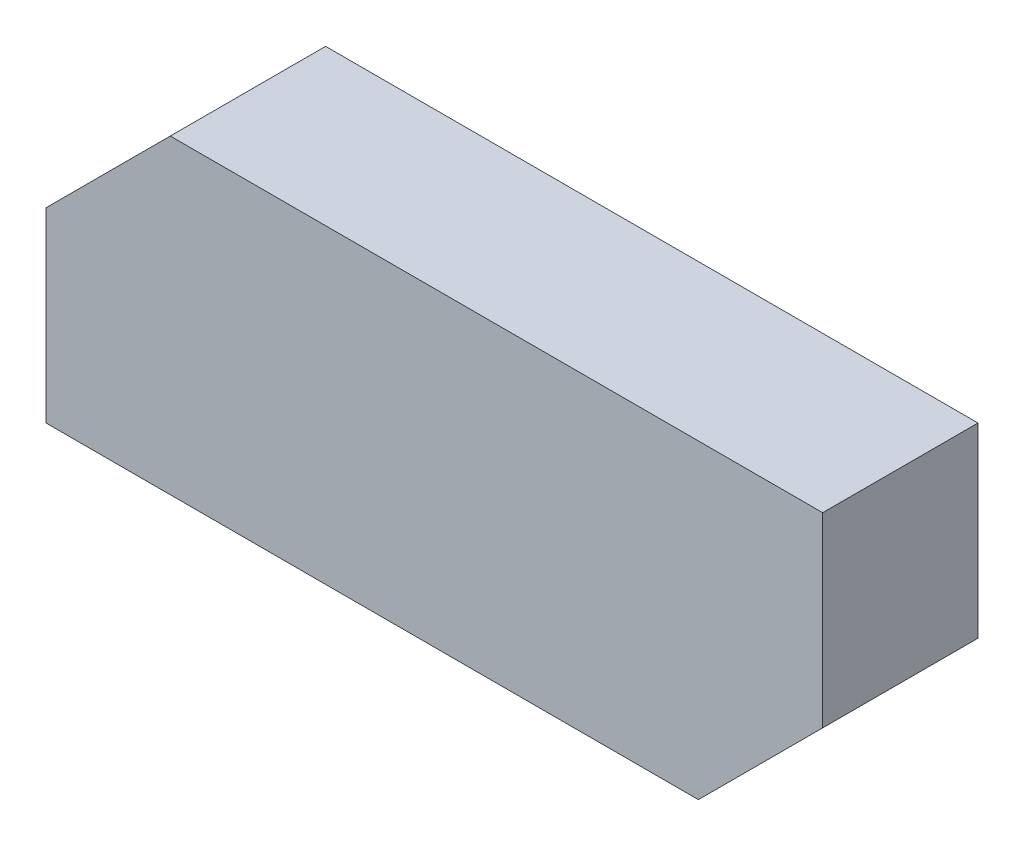
ISO-10303-21;
HEADER;
FILE_DESCRIPTION(('STEP AP214'),'2;1');
FILE_NAME('part.step','',(''),(''),'','','');
FILE_SCHEMA(('AUTOMOTIVE_DESIGN { 1 0 10303 214 1 1 1 1 }'));
ENDSEC;
DATA;
#1=APPLICATION_CONTEXT('core data for automotive mechanical design processes');
#2=APPLICATION_PROTOCOL_DEFINITION('international standard','automotive_design',2000,#1);
#3=PRODUCT_CONTEXT('',#1,'mechanical');
#4=PRODUCT('Part','Part','',(#3));
#5=PRODUCT_RELATED_PRODUCT_CATEGORY('part','',(#4));
#6=PRODUCT_DEFINITION_FORMATION('','',#4);
#7=PRODUCT_DEFINITION_CONTEXT('part definition',#1,'design');
#8=PRODUCT_DEFINITION('design','',#6,#7);
#9=PRODUCT_DEFINITION_SHAPE('','',#8);
#10=(LENGTH_UNIT() NAMED_UNIT(*) SI_UNIT(.MILLI.,.METRE.));
#11=(NAMED_UNIT(*) PLANE_ANGLE_UNIT() SI_UNIT($,.RADIAN.));
#12=(NAMED_UNIT(*) SI_UNIT($,.STERADIAN.) SOLID_ANGLE_UNIT());
#13=UNCERTAINTY_MEASURE_WITH_UNIT(LENGTH_MEASURE(1.E-05),#10,'distance_accuracy_value','');
#14=(GEOMETRIC_REPRESENTATION_CONTEXT(3) GLOBAL_UNCERTAINTY_ASSIGNED_CONTEXT((#13)) GLOBAL_UNIT_ASSIGNED_CONTEXT((#10,
#11,#12)) REPRESENTATION_CONTEXT('',''));
#15=CARTESIAN_POINT('',(0.,0.,0.));
#16=DIRECTION('',(0.,0.,1.));
#17=DIRECTION('',(1.,0.,0.));
#18=AXIS2_PLACEMENT_3D('',#15,#16,#17);
#19=CARTESIAN_POINT('',(25.,10.,10.));
#20=DIRECTION('',(-1.,0.,0.));
#21=DIRECTION('',(0.,-1.,0.));
#22=AXIS2_PLACEMENT_3D('',#19,#20,#21);
#23=PLANE('',#22);
#24=DIRECTION('',(0.,1.,0.));
#25=VECTOR('',#24,1.);
#26=CARTESIAN_POINT('',(25.,10.,10.));
#27=LINE('',#26,#25);
#28=CARTESIAN_POINT('',(25.,-2.00000000000001,10.));
#29=VERTEX_POINT('',#28);
#30=CARTESIAN_POINT('',(25.,10.,10.));
#31=VERTEX_POINT('',#30);
#32=EDGE_CURVE('E85',#29,#31,#27,.T.);
#33=ORIENTED_EDGE('',*,*,#32,.F.);
#34=DIRECTION('',(0.,0.,-1.));
#35=VECTOR('',#34,1.);
#36=CARTESIAN_POINT('',(25.,-2.00000000000001,10.));
#37=LINE('',#36,#35);
#38=CARTESIAN_POINT('',(25.,-2.00000000000001,0.));
#39=VERTEX_POINT('',#38);
#40=EDGE_CURVE('E105',#29,#39,#37,.T.);
#41=ORIENTED_EDGE('',*,*,#40,.T.);
#42=DIRECTION('',(0.,1.,0.));
#43=VECTOR('',#42,1.);
#44=CARTESIAN_POINT('',(25.,10.,0.));
#45=LINE('',#44,#43);
#46=CARTESIAN_POINT('',(25.,10.,0.));
#47=VERTEX_POINT('',#46);
#48=EDGE_CURVE('E103',#39,#47,#45,.T.);
#49=ORIENTED_EDGE('',*,*,#48,.T.);
#50=DIRECTION('',(0.,0.,-1.));
#51=VECTOR('',#50,1.);
#52=CARTESIAN_POINT('',(25.,10.,10.));
#53=LINE('',#52,#51);
#54=EDGE_CURVE('E99',#31,#47,#53,.T.);
#55=ORIENTED_EDGE('',*,*,#54,.F.);
#56=EDGE_LOOP('',(#33,#41,#49,#55));
#57=FACE_BOUND('',#56,.T.);
#58=ADVANCED_FACE('F34',(#57),#23,.F.);
#59=CARTESIAN_POINT('',(-25.,10.,10.));
#60=DIRECTION('',(0.,-1.,0.));
#61=DIRECTION('',(0.,0.,-1.));
#62=AXIS2_PLACEMENT_3D('',#59,#60,#61);
#63=PLANE('',#62);
#64=DIRECTION('',(-1.,0.,0.));
#65=VECTOR('',#64,1.);
#66=CARTESIAN_POINT('',(-25.,10.,0.));
#67=LINE('',#66,#65);
#68=CARTESIAN_POINT('',(-17.,10.,0.));
#69=VERTEX_POINT('',#68);
#70=EDGE_CURVE('E133',#47,#69,#67,.T.);
#71=ORIENTED_EDGE('',*,*,#70,.T.);
#72=DIRECTION('',(0.,0.,1.));
#73=VECTOR('',#72,1.);
#74=CARTESIAN_POINT('',(-17.,10.,10.));
#75=LINE('',#74,#73);
#76=CARTESIAN_POINT('',(-17.,10.,10.));
#77=VERTEX_POINT('',#76);
#78=EDGE_CURVE('E11',#69,#77,#75,.T.);
#79=ORIENTED_EDGE('',*,*,#78,.T.);
#80=DIRECTION('',(-1.,0.,0.));
#81=VECTOR('',#80,1.);
#82=CARTESIAN_POINT('',(-25.,10.,10.));
#83=LINE('',#82,#81);
#84=EDGE_CURVE('E88',#31,#77,#83,.T.);
#85=ORIENTED_EDGE('',*,*,#84,.F.);
#86=ORIENTED_EDGE('',*,*,#54,.T.);
#87=EDGE_LOOP('',(#71,#79,#85,#86));
#88=FACE_BOUND('',#87,.T.);
#89=ADVANCED_FACE('F98',(#88),#63,.F.);
#90=CARTESIAN_POINT('',(-25.,10.,10.));
#91=DIRECTION('',(1.,0.,0.));
#92=DIRECTION('',(0.,1.,0.));
#93=AXIS2_PLACEMENT_3D('',#90,#91,#92);
#94=PLANE('',#93);
#95=DIRECTION('',(0.,-1.,0.));
#96=VECTOR('',#95,1.);
#97=CARTESIAN_POINT('',(-25.,10.,10.));
#98=LINE('',#97,#96);
#99=CARTESIAN_POINT('',(-25.,2.00000000000001,10.));
#100=VERTEX_POINT('',#99);
#101=CARTESIAN_POINT('',(-25.,-10.,10.));
#102=VERTEX_POINT('',#101);
#103=EDGE_CURVE('E100',#100,#102,#98,.T.);
#104=ORIENTED_EDGE('',*,*,#103,.F.);
#105=DIRECTION('',(0.,0.,-1.));
#106=VECTOR('',#105,1.);
#107=CARTESIAN_POINT('',(-25.,2.00000000000001,10.));
#108=LINE('',#107,#106);
#109=CARTESIAN_POINT('',(-25.,2.00000000000001,0.));
#110=VERTEX_POINT('',#109);
#111=EDGE_CURVE('E42',#100,#110,#108,.T.);
#112=ORIENTED_EDGE('',*,*,#111,.T.);
#113=DIRECTION('',(0.,-1.,0.));
#114=VECTOR('',#113,1.);
#115=CARTESIAN_POINT('',(-25.,10.,0.));
#116=LINE('',#115,#114);
#117=CARTESIAN_POINT('',(-25.,-10.,0.));
#118=VERTEX_POINT('',#117);
#119=EDGE_CURVE('E127',#110,#118,#116,.T.);
#120=ORIENTED_EDGE('',*,*,#119,.T.);
#121=DIRECTION('',(0.,0.,-1.));
#122=VECTOR('',#121,1.);
#123=CARTESIAN_POINT('',(-25.,-10.,10.));
#124=LINE('',#123,#122);
#125=EDGE_CURVE('E106',#102,#118,#124,.T.);
#126=ORIENTED_EDGE('',*,*,#125,.F.);
#127=EDGE_LOOP('',(#104,#112,#120,#126));
#128=FACE_BOUND('',#127,.T.);
#129=ADVANCED_FACE('F125',(#128),#94,.F.);
#130=CARTESIAN_POINT('',(-25.,-10.,10.));
#131=DIRECTION('',(0.,1.,0.));
#132=DIRECTION('',(0.,0.,1.));
#133=AXIS2_PLACEMENT_3D('',#130,#131,#132);
#134=PLANE('',#133);
#135=DIRECTION('',(1.,0.,0.));
#136=VECTOR('',#135,1.);
#137=CARTESIAN_POINT('',(-25.,-10.,0.));
#138=LINE('',#137,#136);
#139=CARTESIAN_POINT('',(17.,-10.,0.));
#140=VERTEX_POINT('',#139);
#141=EDGE_CURVE('E95',#118,#140,#138,.T.);
#142=ORIENTED_EDGE('',*,*,#141,.T.);
#143=DIRECTION('',(0.,0.,1.));
#144=VECTOR('',#143,1.);
#145=CARTESIAN_POINT('',(17.,-10.,10.));
#146=LINE('',#145,#144);
#147=CARTESIAN_POINT('',(17.,-10.,10.));
#148=VERTEX_POINT('',#147);
#149=EDGE_CURVE('E118',#140,#148,#146,.T.);
#150=ORIENTED_EDGE('',*,*,#149,.T.);
#151=DIRECTION('',(1.,0.,0.));
#152=VECTOR('',#151,1.);
#153=CARTESIAN_POINT('',(-25.,-10.,10.));
#154=LINE('',#153,#152);
#155=EDGE_CURVE('E111',#102,#148,#154,.T.);
#156=ORIENTED_EDGE('',*,*,#155,.F.);
#157=ORIENTED_EDGE('',*,*,#125,.T.);
#158=EDGE_LOOP('',(#142,#150,#156,#157));
#159=FACE_BOUND('',#158,.T.);
#160=ADVANCED_FACE('F141',(#159),#134,.F.);
#161=CARTESIAN_POINT('',(0.,0.,10.));
#162=DIRECTION('',(0.,0.,1.));
#163=DIRECTION('',(1.,0.,0.));
#164=AXIS2_PLACEMENT_3D('',#161,#162,#163);
#165=PLANE('',#164);
#166=ORIENTED_EDGE('',*,*,#155,.T.);
#167=DIRECTION('',(-0.707106781186549,-0.707106781186546,0.));
#168=VECTOR('',#167,1.);
#169=CARTESIAN_POINT('',(13.4999999999999,-13.5,10.));
#170=LINE('',#169,#168);
#171=EDGE_CURVE('E90',#148,#29,#170,.F.);
#172=ORIENTED_EDGE('',*,*,#171,.T.);
#173=ORIENTED_EDGE('',*,*,#32,.T.);
#174=ORIENTED_EDGE('',*,*,#84,.T.);
#175=DIRECTION('',(0.707106781186549,0.707106781186546,0.));
#176=VECTOR('',#175,1.);
#177=CARTESIAN_POINT('',(-13.4999999999999,13.5,10.));
#178=LINE('',#177,#176);
#179=EDGE_CURVE('E49',#77,#100,#178,.F.);
#180=ORIENTED_EDGE('',*,*,#179,.T.);
#181=ORIENTED_EDGE('',*,*,#103,.T.);
#182=EDGE_LOOP('',(#166,#172,#173,#174,#180,#181));
#183=FACE_BOUND('',#182,.T.);
#184=ADVANCED_FACE('F87',(#183),#165,.T.);
#185=CARTESIAN_POINT('',(0.,0.,0.));
#186=DIRECTION('',(0.,0.,1.));
#187=DIRECTION('',(1.,0.,0.));
#188=AXIS2_PLACEMENT_3D('',#185,#186,#187);
#189=PLANE('',#188);
#190=ORIENTED_EDGE('',*,*,#48,.F.);
#191=DIRECTION('',(0.707106781186549,0.707106781186546,0.));
#192=VECTOR('',#191,1.);
#193=CARTESIAN_POINT('',(25.,-2.00000000000001,0.));
#194=LINE('',#193,#192);
#195=EDGE_CURVE('E116',#39,#140,#194,.F.);
#196=ORIENTED_EDGE('',*,*,#195,.T.);
#197=ORIENTED_EDGE('',*,*,#141,.F.);
#198=ORIENTED_EDGE('',*,*,#119,.F.);
#199=DIRECTION('',(-0.707106781186549,-0.707106781186546,0.));
#200=VECTOR('',#199,1.);
#201=CARTESIAN_POINT('',(-25.,2.00000000000001,0.));
#202=LINE('',#201,#200);
#203=EDGE_CURVE('E108',#110,#69,#202,.F.);
#204=ORIENTED_EDGE('',*,*,#203,.T.);
#205=ORIENTED_EDGE('',*,*,#70,.F.);
#206=EDGE_LOOP('',(#190,#196,#197,#198,#204,#205));
#207=FACE_BOUND('',#206,.T.);
#208=ADVANCED_FACE('F131',(#207),#189,.F.);
#209=CARTESIAN_POINT('',(25.,-2.00000000000001,10.));
#210=DIRECTION('',(-0.707106781186546,0.707106781186549,0.));
#211=DIRECTION('',(0.,0.,-1.));
#212=AXIS2_PLACEMENT_3D('',#209,#210,#211);
#213=PLANE('',#212);
#214=ORIENTED_EDGE('',*,*,#171,.F.);
#215=ORIENTED_EDGE('',*,*,#149,.F.);
#216=ORIENTED_EDGE('',*,*,#195,.F.);
#217=ORIENTED_EDGE('',*,*,#40,.F.);
#218=EDGE_LOOP('',(#214,#215,#216,#217));
#219=FACE_BOUND('',#218,.T.);
#220=ADVANCED_FACE('F144',(#219),#213,.F.);
#221=CARTESIAN_POINT('',(-25.,2.00000000000001,10.));
#222=DIRECTION('',(0.707106781186546,-0.707106781186549,0.));
#223=DIRECTION('',(0.,0.,-1.));
#224=AXIS2_PLACEMENT_3D('',#221,#222,#223);
#225=PLANE('',#224);
#226=ORIENTED_EDGE('',*,*,#179,.F.);
#227=ORIENTED_EDGE('',*,*,#78,.F.);
#228=ORIENTED_EDGE('',*,*,#203,.F.);
#229=ORIENTED_EDGE('',*,*,#111,.F.);
#230=EDGE_LOOP('',(#226,#227,#228,#229));
#231=FACE_BOUND('',#230,.T.);
#232=ADVANCED_FACE('F36',(#231),#225,.F.);
#233=CLOSED_SHELL('',(#58,#89,#129,#160,#184,#208,#220,#232));
#234=MANIFOLD_SOLID_BREP('B2',#233);
#235=ADVANCED_BREP_SHAPE_REPRESENTATION('',(#18,#234),#14);
#236=SHAPE_DEFINITION_REPRESENTATION(#9,#235);
ENDSEC;
END-ISO-10303-21;
